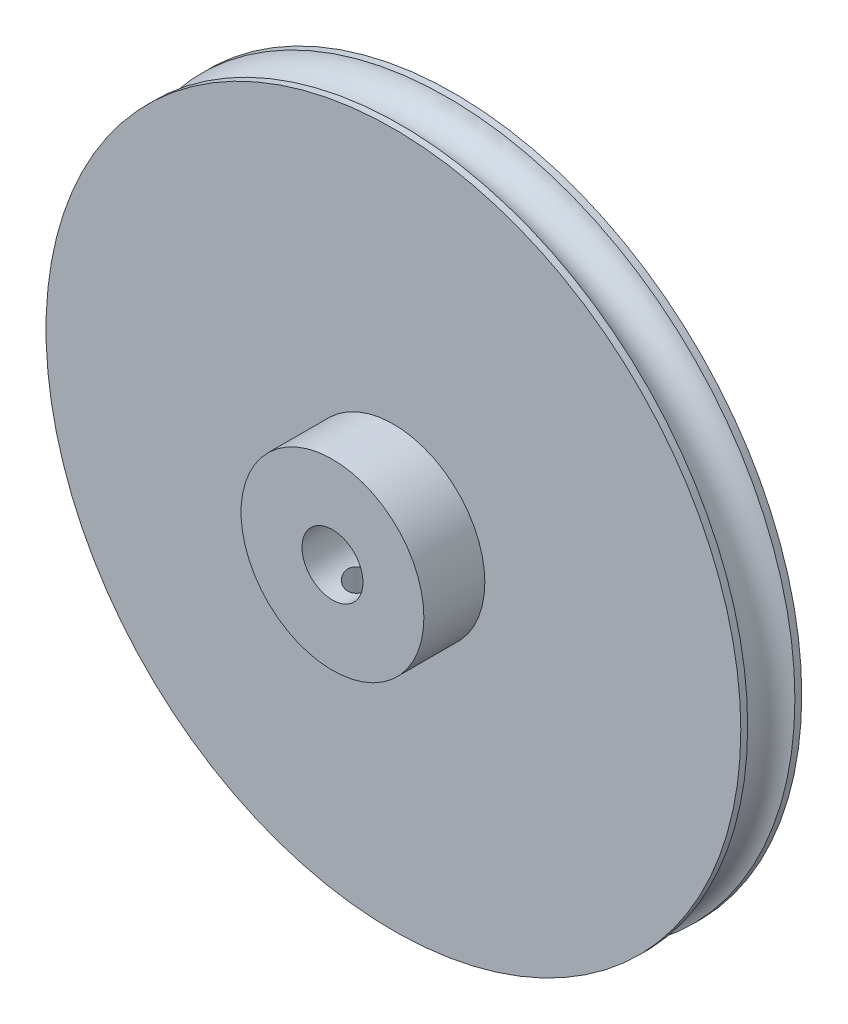
ISO-10303-21;
HEADER;
FILE_DESCRIPTION(('STEP AP214'),'2;1');
FILE_NAME('part.step','',(''),(''),'','','');
FILE_SCHEMA(('AUTOMOTIVE_DESIGN { 1 0 10303 214 1 1 1 1 }'));
ENDSEC;
DATA;
#1=APPLICATION_CONTEXT('core data for automotive mechanical design processes');
#2=APPLICATION_PROTOCOL_DEFINITION('international standard','automotive_design',2000,#1);
#3=PRODUCT_CONTEXT('',#1,'mechanical');
#4=PRODUCT('Part','Part','',(#3));
#5=PRODUCT_RELATED_PRODUCT_CATEGORY('part','',(#4));
#6=PRODUCT_DEFINITION_FORMATION('','',#4);
#7=PRODUCT_DEFINITION_CONTEXT('part definition',#1,'design');
#8=PRODUCT_DEFINITION('design','',#6,#7);
#9=PRODUCT_DEFINITION_SHAPE('','',#8);
#10=(LENGTH_UNIT() NAMED_UNIT(*) SI_UNIT(.MILLI.,.METRE.));
#11=(NAMED_UNIT(*) PLANE_ANGLE_UNIT() SI_UNIT($,.RADIAN.));
#12=(NAMED_UNIT(*) SI_UNIT($,.STERADIAN.) SOLID_ANGLE_UNIT());
#13=UNCERTAINTY_MEASURE_WITH_UNIT(LENGTH_MEASURE(1.E-05),#10,'distance_accuracy_value','');
#14=(GEOMETRIC_REPRESENTATION_CONTEXT(3) GLOBAL_UNCERTAINTY_ASSIGNED_CONTEXT((#13)) GLOBAL_UNIT_ASSIGNED_CONTEXT((#10,
#11,#12)) REPRESENTATION_CONTEXT('',''));
#15=CARTESIAN_POINT('',(0.,0.,0.));
#16=DIRECTION('',(0.,0.,1.));
#17=DIRECTION('',(1.,0.,0.));
#18=AXIS2_PLACEMENT_3D('',#15,#16,#17);
#19=CARTESIAN_POINT('',(0.,0.,-5.));
#20=DIRECTION('',(0.,0.,1.));
#21=DIRECTION('',(1.,0.,0.));
#22=AXIS2_PLACEMENT_3D('',#19,#20,#21);
#23=CYLINDRICAL_SURFACE('',#22,28.5);
#24=CARTESIAN_POINT('',(0.,0.,0.));
#25=DIRECTION('',(0.,0.,1.));
#26=DIRECTION('',(1.,0.,0.));
#27=AXIS2_PLACEMENT_3D('',#24,#25,#26);
#28=CIRCLE('',#27,28.5);
#29=CARTESIAN_POINT('',(28.5,0.,0.));
#30=VERTEX_POINT('',#29);
#31=EDGE_CURVE('E43',#30,#30,#28,.T.);
#32=ORIENTED_EDGE('',*,*,#31,.F.);
#33=EDGE_LOOP('',(#32));
#34=FACE_BOUND('',#33,.T.);
#35=CARTESIAN_POINT('',(0.,0.,-0.563508326896291));
#36=DIRECTION('',(0.,0.,-1.));
#37=DIRECTION('',(-1.,0.,0.));
#38=AXIS2_PLACEMENT_3D('',#35,#36,#37);
#39=CIRCLE('',#38,28.5);
#40=CARTESIAN_POINT('',(-28.5,0.,-0.563508326896291));
#41=VERTEX_POINT('',#40);
#42=EDGE_CURVE('E56',#41,#41,#39,.F.);
#43=ORIENTED_EDGE('',*,*,#42,.T.);
#44=EDGE_LOOP('',(#43));
#45=FACE_BOUND('',#44,.T.);
#46=ADVANCED_FACE('F32',(#34,#45),#23,.T.);
#47=CARTESIAN_POINT('',(0.,0.,-5.));
#48=DIRECTION('',(0.,0.,1.));
#49=DIRECTION('',(1.,0.,0.));
#50=AXIS2_PLACEMENT_3D('',#47,#48,#49);
#51=CIRCLE('',#50,28.5);
#52=CARTESIAN_POINT('',(28.5,0.,-5.));
#53=VERTEX_POINT('',#52);
#54=EDGE_CURVE('E10',#53,#53,#51,.T.);
#55=ORIENTED_EDGE('',*,*,#54,.T.);
#56=EDGE_LOOP('',(#55));
#57=FACE_BOUND('',#56,.T.);
#58=CARTESIAN_POINT('',(0.,0.,-4.43649167310371));
#59=DIRECTION('',(0.,0.,1.));
#60=DIRECTION('',(1.,0.,0.));
#61=AXIS2_PLACEMENT_3D('',#58,#59,#60);
#62=CIRCLE('',#61,28.5);
#63=CARTESIAN_POINT('',(28.5,0.,-4.43649167310371));
#64=VERTEX_POINT('',#63);
#65=EDGE_CURVE('E54',#64,#64,#62,.F.);
#66=ORIENTED_EDGE('',*,*,#65,.T.);
#67=EDGE_LOOP('',(#66));
#68=FACE_BOUND('',#67,.T.);
#69=ADVANCED_FACE('F84',(#57,#68),#23,.T.);
#70=CARTESIAN_POINT('',(0.,0.,0.));
#71=DIRECTION('',(0.,0.,1.));
#72=DIRECTION('',(1.,0.,0.));
#73=AXIS2_PLACEMENT_3D('',#70,#71,#72);
#74=PLANE('',#73);
#75=ORIENTED_EDGE('',*,*,#31,.T.);
#76=EDGE_LOOP('',(#75));
#77=FACE_BOUND('',#76,.T.);
#78=CARTESIAN_POINT('',(0.,0.,0.));
#79=DIRECTION('',(0.,0.,1.));
#80=DIRECTION('',(1.,0.,0.));
#81=AXIS2_PLACEMENT_3D('',#78,#79,#80);
#82=CIRCLE('',#81,7.5);
#83=CARTESIAN_POINT('',(7.5,0.,0.));
#84=VERTEX_POINT('',#83);
#85=EDGE_CURVE('E51',#84,#84,#82,.T.);
#86=ORIENTED_EDGE('',*,*,#85,.F.);
#87=EDGE_LOOP('',(#86));
#88=FACE_BOUND('',#87,.T.);
#89=ADVANCED_FACE('F81',(#77,#88),#74,.T.);
#90=CARTESIAN_POINT('',(0.,0.,-5.));
#91=DIRECTION('',(0.,0.,1.));
#92=DIRECTION('',(1.,0.,0.));
#93=AXIS2_PLACEMENT_3D('',#90,#91,#92);
#94=PLANE('',#93);
#95=CARTESIAN_POINT('',(0.,0.,-5.));
#96=DIRECTION('',(0.,0.,1.));
#97=DIRECTION('',(1.,0.,0.));
#98=AXIS2_PLACEMENT_3D('',#95,#96,#97);
#99=CIRCLE('',#98,2.5);
#100=CARTESIAN_POINT('',(2.5,0.,-5.));
#101=VERTEX_POINT('',#100);
#102=EDGE_CURVE('E63',#101,#101,#99,.F.);
#103=ORIENTED_EDGE('',*,*,#102,.F.);
#104=EDGE_LOOP('',(#103));
#105=FACE_BOUND('',#104,.T.);
#106=ORIENTED_EDGE('',*,*,#54,.F.);
#107=EDGE_LOOP('',(#106));
#108=FACE_BOUND('',#107,.T.);
#109=ADVANCED_FACE('F83',(#105,#108),#94,.F.);
#110=CARTESIAN_POINT('',(0.,0.,5.));
#111=DIRECTION('',(0.,0.,-1.));
#112=DIRECTION('',(-1.,0.,0.));
#113=AXIS2_PLACEMENT_3D('',#110,#111,#112);
#114=CYLINDRICAL_SURFACE('',#113,7.5);
#115=CARTESIAN_POINT('',(0.,-7.5,3.74999999999999));
#116=CARTESIAN_POINT('',(0.0696954524791068,-7.49999880584412,3.74999720552608));
#117=CARTESIAN_POINT('',(0.139428940919409,-7.49901838956517,3.74415136251553));
#118=CARTESIAN_POINT('',(0.276940110836519,-7.49520172470694,3.72093217061733));
#119=CARTESIAN_POINT('',(0.344715933979621,-7.49236376961945,3.70354822154419));
#120=CARTESIAN_POINT('',(0.476302373606318,-7.48515034118225,3.65779227570361));
#121=CARTESIAN_POINT('',(0.540116184215946,-7.48077612579597,3.6294292671797));
#122=CARTESIAN_POINT('',(0.662070920988967,-7.47097113541035,3.56254385397379));
#123=CARTESIAN_POINT('',(0.72021249493929,-7.46554048127217,3.52402261125849));
#124=CARTESIAN_POINT('',(0.829736307145833,-7.45416658729157,3.43752245808976));
#125=CARTESIAN_POINT('',(0.881056451767477,-7.44821935907428,3.38946544268193));
#126=CARTESIAN_POINT('',(0.974944249329956,-7.43651313438366,3.28542601576359));
#127=CARTESIAN_POINT('',(1.01751134969548,-7.43075414981334,3.22944310427169));
#128=CARTESIAN_POINT('',(1.09293356280256,-7.4200378287989,3.11071451690147));
#129=CARTESIAN_POINT('',(1.12572727643049,-7.41508564545818,3.04792933159762));
#130=CARTESIAN_POINT('',(1.1802791827056,-7.40659894897338,2.91764521784968));
#131=CARTESIAN_POINT('',(1.2020381207828,-7.40306434007154,2.85014660816118));
#132=CARTESIAN_POINT('',(1.23370718889239,-7.39785268421378,2.71300986257173));
#133=CARTESIAN_POINT('',(1.24372451456769,-7.3961588424285,2.6433971317493));
#134=CARTESIAN_POINT('',(1.25195836264493,-7.39476969468325,2.50345986155826));
#135=CARTESIAN_POINT('',(1.25017572019449,-7.39507424728607,2.43313537291635));
#136=CARTESIAN_POINT('',(1.23494754919807,-7.39763214431778,2.29453606936228));
#137=CARTESIAN_POINT('',(1.22162244094488,-7.39986536659459,2.22624759822739));
#138=CARTESIAN_POINT('',(1.18387657020171,-7.40599747605504,2.09288934108544));
#139=CARTESIAN_POINT('',(1.15945542715986,-7.40989642036636,2.02781966555573));
#140=CARTESIAN_POINT('',(1.10008862304695,-7.4189423966705,1.90238558827955));
#141=CARTESIAN_POINT('',(1.06509295693985,-7.42409533553663,1.84204529695939));
#142=CARTESIAN_POINT('',(0.985606008778709,-7.43506459207505,1.72804779973081));
#143=CARTESIAN_POINT('',(0.941113960327136,-7.44088096327143,1.67439113377254));
#144=CARTESIAN_POINT('',(0.84324110607952,-7.45261013939893,1.57458695709633));
#145=CARTESIAN_POINT('',(0.789756981936557,-7.45852324615826,1.52854074072997));
#146=CARTESIAN_POINT('',(0.675767624490818,-7.46971300698362,1.44606111866734));
#147=CARTESIAN_POINT('',(0.615262345953206,-7.47498965694873,1.40962777490839));
#148=CARTESIAN_POINT('',(0.488852958083351,-7.48431946446456,1.34739888643187));
#149=CARTESIAN_POINT('',(0.422944362782327,-7.48837159203724,1.32161229033438));
#150=CARTESIAN_POINT('',(0.287649172801363,-7.4947875150633,1.28150289237702));
#151=CARTESIAN_POINT('',(0.218262869589732,-7.49715145175237,1.26717913151315));
#152=CARTESIAN_POINT('',(0.078854950650811,-7.49990564921343,1.25053932076944));
#153=CARTESIAN_POINT('',(0.00885036857550532,-7.50031876506392,1.24808421409721));
#154=CARTESIAN_POINT('',(-0.130569886444943,-7.49918737210585,1.25488067221407));
#155=CARTESIAN_POINT('',(-0.199985581946018,-7.49764293862059,1.26413178656688));
#156=CARTESIAN_POINT('',(-0.335828087773379,-7.49278413469101,1.29396242466775));
#157=CARTESIAN_POINT('',(-0.402270434192687,-7.48948052400655,1.31447310419507));
#158=CARTESIAN_POINT('',(-0.530773442430217,-7.48147232227679,1.36616725909978));
#159=CARTESIAN_POINT('',(-0.592833857954855,-7.4767676525601,1.39735133381765));
#160=CARTESIAN_POINT('',(-0.711415344734474,-7.46642258151204,1.4698255623484));
#161=CARTESIAN_POINT('',(-0.767882625468568,-7.46077427943511,1.51120257808363));
#162=CARTESIAN_POINT('',(-0.873121792751337,-7.4491923369595,1.60276865769254));
#163=CARTESIAN_POINT('',(-0.921893119848284,-7.44325867585773,1.65295836163834));
#164=CARTESIAN_POINT('',(-1.01087138982899,-7.43170087617923,1.76134877403572));
#165=CARTESIAN_POINT('',(-1.05098438055685,-7.42608058068553,1.81962708275721));
#166=CARTESIAN_POINT('',(-1.12085115514748,-7.41585764888942,1.94217648456927));
#167=CARTESIAN_POINT('',(-1.1506052673849,-7.4112549803301,2.00644738761375));
#168=CARTESIAN_POINT('',(-1.19876916573657,-7.40361726848852,2.13889486640607));
#169=CARTESIAN_POINT('',(-1.21722571627396,-7.40057577155532,2.20705404751525));
#170=CARTESIAN_POINT('',(-1.24241772688913,-7.39638858417631,2.34556006461088));
#171=CARTESIAN_POINT('',(-1.24915420597307,-7.39524272891361,2.41590670986603));
#172=CARTESIAN_POINT('',(-1.25068643302367,-7.39498366542006,2.5558525829812));
#173=CARTESIAN_POINT('',(-1.24563006806258,-7.39584528252825,2.62545018928764));
#174=CARTESIAN_POINT('',(-1.22403991947841,-7.39944890726864,2.76278962402538));
#175=CARTESIAN_POINT('',(-1.20750617305623,-7.40219090880607,2.83053145847093));
#176=CARTESIAN_POINT('',(-1.16348724479744,-7.40923678140859,2.9621792186463));
#177=CARTESIAN_POINT('',(-1.13601479530021,-7.41353883609835,3.02608950502801));
#178=CARTESIAN_POINT('',(-1.07091350195795,-7.42322184461104,3.14841783459742));
#179=CARTESIAN_POINT('',(-1.03328415437427,-7.428602851942,3.20683560518606));
#180=CARTESIAN_POINT('',(-0.94840944218607,-7.43991727022811,3.31726779155387));
#181=CARTESIAN_POINT('',(-0.901055281796816,-7.44585647788151,3.36919800835013));
#182=CARTESIAN_POINT('',(-0.798304515690108,-7.45757186180421,3.46442580223746));
#183=CARTESIAN_POINT('',(-0.742906056456312,-7.46334800013273,3.50772138431908));
#184=CARTESIAN_POINT('',(-0.625184584820136,-7.4741326482111,3.58472413409996));
#185=CARTESIAN_POINT('',(-0.562816393766405,-7.47913558126552,3.61836301965647));
#186=CARTESIAN_POINT('',(-0.433256534689487,-7.48775583800888,3.67463474230495));
#187=CARTESIAN_POINT('',(-0.366069747415002,-7.49137454088741,3.69727854053984));
#188=CARTESIAN_POINT('',(-0.248851655022698,-7.49602895416478,3.72600263706332));
#189=CARTESIAN_POINT('',(-0.199529415149222,-7.49751013636679,3.73498723480797));
#190=CARTESIAN_POINT('',(-0.100144655159903,-7.4994960799306,3.74698686892237));
#191=CARTESIAN_POINT('',(-0.0500821478042465,-7.50000085810321,3.75000200806867));
#192=CARTESIAN_POINT('',(0.,-7.5,3.74999999999999));
#193=B_SPLINE_CURVE_WITH_KNOTS('',3,(#115,#116,#117,#118,#119,#120,#121,#122,#123,#124,#125,
#126,#127,#128,#129,#130,#131,#132,#133,#134,#135,#136,#137,#138,#139,#140,#141,#142,#143,#144,
#145,#146,#147,#148,#149,#150,#151,#152,#153,#154,#155,#156,#157,#158,#159,#160,#161,#162,#163,
#164,#165,#166,#167,#168,#169,#170,#171,#172,#173,#174,#175,#176,#177,#178,#179,#180,#181,#182,
#183,#184,#185,#186,#187,#188,#189,#190,#191,#192),.UNSPECIFIED.,.T.,.F.,(4,2,2,2,2,2,2,2,2,2,2,
2,2,2,2,2,2,2,2,2,2,2,2,2,2,2,2,2,2,2,2,2,2,2,2,2,2,2,4),(0.,0.208903292469253,
0.417998772847707,0.62692343351263,0.835824206337388,1.04651245531165,1.25721400084927,
1.46921260411919,1.68119688438089,1.8912303855171,2.10124902160442,2.30910260880203,
2.51696332512689,2.72582278316277,2.93469910340284,3.14616384955661,3.35762995817921,
3.56927344457949,3.78089922260571,3.99003941745695,4.19917156517926,4.40703903503204,
4.61491817913029,4.82463412813508,5.03436531527137,5.24626911003805,5.45816618687967,
5.66918011170882,5.88017568893304,6.08853954761345,6.29690273094061,6.50502409113106,
6.71315577514663,6.9237569209669,7.1344066693948,7.34651115803594,7.5584037606503,
7.70852124082003,7.85863613638478),.UNSPECIFIED.);
#194=CARTESIAN_POINT('',(0.,-7.5,3.74999999999999));
#195=VERTEX_POINT('',#194);
#196=EDGE_CURVE('E35',#195,#195,#193,.T.);
#197=ORIENTED_EDGE('',*,*,#196,.T.);
#198=EDGE_LOOP('',(#197));
#199=FACE_BOUND('',#198,.T.);
#200=CARTESIAN_POINT('',(0.,0.,5.));
#201=DIRECTION('',(0.,0.,1.));
#202=DIRECTION('',(1.,0.,0.));
#203=AXIS2_PLACEMENT_3D('',#200,#201,#202);
#204=CIRCLE('',#203,7.5);
#205=CARTESIAN_POINT('',(7.5,0.,5.));
#206=VERTEX_POINT('',#205);
#207=EDGE_CURVE('E48',#206,#206,#204,.T.);
#208=ORIENTED_EDGE('',*,*,#207,.F.);
#209=EDGE_LOOP('',(#208));
#210=FACE_BOUND('',#209,.T.);
#211=ORIENTED_EDGE('',*,*,#85,.T.);
#212=EDGE_LOOP('',(#211));
#213=FACE_BOUND('',#212,.T.);
#214=ADVANCED_FACE('F79',(#199,#210,#213),#114,.T.);
#215=CARTESIAN_POINT('',(0.,0.,5.));
#216=DIRECTION('',(0.,0.,1.));
#217=DIRECTION('',(1.,0.,0.));
#218=AXIS2_PLACEMENT_3D('',#215,#216,#217);
#219=PLANE('',#218);
#220=CARTESIAN_POINT('',(0.,0.,5.));
#221=DIRECTION('',(0.,0.,1.));
#222=DIRECTION('',(1.,0.,0.));
#223=AXIS2_PLACEMENT_3D('',#220,#221,#222);
#224=CIRCLE('',#223,2.5);
#225=CARTESIAN_POINT('',(2.5,0.,5.));
#226=VERTEX_POINT('',#225);
#227=EDGE_CURVE('E59',#226,#226,#224,.T.);
#228=ORIENTED_EDGE('',*,*,#227,.F.);
#229=EDGE_LOOP('',(#228));
#230=FACE_BOUND('',#229,.T.);
#231=ORIENTED_EDGE('',*,*,#207,.T.);
#232=EDGE_LOOP('',(#231));
#233=FACE_BOUND('',#232,.T.);
#234=ADVANCED_FACE('F128',(#230,#233),#219,.T.);
#235=CARTESIAN_POINT('',(0.,0.,-5.001));
#236=DIRECTION('',(0.,0.,1.));
#237=DIRECTION('',(1.,0.,0.));
#238=AXIS2_PLACEMENT_3D('',#235,#236,#237);
#239=CYLINDRICAL_SURFACE('',#238,2.5);
#240=CARTESIAN_POINT('',(0.,-2.5,3.74999999999999));
#241=CARTESIAN_POINT('',(-0.0657149536912326,-2.49999641755189,3.74999587210061));
#242=CARTESIAN_POINT('',(-0.13150824962254,-2.49738113774397,3.7447874085979));
#243=CARTESIAN_POINT('',(-0.26115029408553,-2.48717695046745,3.72418389957384));
#244=CARTESIAN_POINT('',(-0.324995108391877,-2.47957859786229,3.70876950875293));
#245=CARTESIAN_POINT('',(-0.448666931100715,-2.4602034925414,3.668507739229));
#246=CARTESIAN_POINT('',(-0.508508503673971,-2.448442989719,3.64369701968998));
#247=CARTESIAN_POINT('',(-0.623090771008202,-2.42182220644723,3.58553672329381));
#248=CARTESIAN_POINT('',(-0.677831867487558,-2.40696217041913,3.55218781968893));
#249=CARTESIAN_POINT('',(-0.784384772202393,-2.37445322822571,3.47560343814337));
#250=CARTESIAN_POINT('',(-0.835819013902634,-2.3566899890942,3.43189190095044));
#251=CARTESIAN_POINT('',(-0.930974306083715,-2.32074962808431,3.3368481509412));
#252=CARTESIAN_POINT('',(-0.974689478883451,-2.30257220261294,3.28551018528444));
#253=CARTESIAN_POINT('',(-1.05656500056284,-2.26623688996684,3.17189581309577));
#254=CARTESIAN_POINT('',(-1.09403166943954,-2.24818983712665,3.1090798770676));
#255=CARTESIAN_POINT('',(-1.15771028361336,-2.21607473465401,2.97704083001723));
#256=CARTESIAN_POINT('',(-1.18393026870791,-2.20200384508738,2.90782233909656));
#257=CARTESIAN_POINT('',(-1.22266555273573,-2.18072333797261,2.76916861822259));
#258=CARTESIAN_POINT('',(-1.23590732135054,-2.17315339479642,2.69999443491575));
#259=CARTESIAN_POINT('',(-1.25053374163605,-2.1647736243566,2.56002645277565));
#260=CARTESIAN_POINT('',(-1.25193011046633,-2.16395711679111,2.48923432391106));
#261=CARTESIAN_POINT('',(-1.24335910896536,-2.16888662821561,2.35714246960579));
#262=CARTESIAN_POINT('',(-1.23473069942102,-2.17385954577518,2.29571996097119));
#263=CARTESIAN_POINT('',(-1.20867481132116,-2.18845285917313,2.1753476132837));
#264=CARTESIAN_POINT('',(-1.19124452987205,-2.19807473539721,2.11639856836836));
#265=CARTESIAN_POINT('',(-1.14776222548249,-2.22109345515927,2.00096358429293));
#266=CARTESIAN_POINT('',(-1.12151883389498,-2.23457300829999,1.94456700151777));
#267=CARTESIAN_POINT('',(-1.06130210958499,-2.26379255351755,1.83670713426249));
#268=CARTESIAN_POINT('',(-1.02732530476557,-2.27953355975239,1.78524608049989));
#269=CARTESIAN_POINT('',(-0.947582568640976,-2.31391447379108,1.68184843407097));
#270=CARTESIAN_POINT('',(-0.900868072961593,-2.33266887795933,1.63067890802981));
#271=CARTESIAN_POINT('',(-0.799444473426708,-2.36934529125509,1.53658072676138));
#272=CARTESIAN_POINT('',(-0.744731570717848,-2.38726689948501,1.49365600995765));
#273=CARTESIAN_POINT('',(-0.625645632289803,-2.42127484103705,1.41539292371285));
#274=CARTESIAN_POINT('',(-0.560941989499254,-2.43723730202509,1.38049940944283));
#275=CARTESIAN_POINT('',(-0.42558276936099,-2.46447351401553,1.32237871369625));
#276=CARTESIAN_POINT('',(-0.35493197033159,-2.47575098679441,1.29914226873105));
#277=CARTESIAN_POINT('',(-0.215958114575873,-2.49155417176795,1.26690574535417));
#278=CARTESIAN_POINT('',(-0.147926913185401,-2.4965617287664,1.25688595531654));
#279=CARTESIAN_POINT('',(-0.0109744999366891,-2.50091266823877,1.2481690860819));
#280=CARTESIAN_POINT('',(0.057946274837379,-2.5002587340164,1.24946664295066));
#281=CARTESIAN_POINT('',(0.189041214982493,-2.49363990316801,1.26275836052345));
#282=CARTESIAN_POINT('',(0.251324260062444,-2.48809057110237,1.27391566591255));
#283=CARTESIAN_POINT('',(0.373008615377396,-2.47277714143524,1.30529758986887));
#284=CARTESIAN_POINT('',(0.432409607113745,-2.46301257917916,1.32552320806671));
#285=CARTESIAN_POINT('',(0.54861076056208,-2.43980314267087,1.37499808304148));
#286=CARTESIAN_POINT('',(0.60528799625769,-2.42626102212424,1.40448881264603));
#287=CARTESIAN_POINT('',(0.713076702123648,-2.39679967896386,1.47138441955756));
#288=CARTESIAN_POINT('',(0.764185787219099,-2.38087944457232,1.5087926682418));
#289=CARTESIAN_POINT('',(0.864709611613313,-2.34635276671831,1.5947005316661));
#290=CARTESIAN_POINT('',(0.913465097280794,-2.32763606060552,1.64392858556697));
#291=CARTESIAN_POINT('',(1.00232040139154,-2.29077989504843,1.74990643908664));
#292=CARTESIAN_POINT('',(1.04241423211355,-2.27264084226908,1.80666139852048));
#293=CARTESIAN_POINT('',(1.11463489312211,-2.23813990282585,1.9295545677504));
#294=CARTESIAN_POINT('',(1.14628186984829,-2.2219066207934,1.99601408276075));
#295=CARTESIAN_POINT('',(1.19760353251725,-2.19467590460158,2.13438758461566));
#296=CARTESIAN_POINT('',(1.21729364485945,-2.18367172800773,2.20629440812649));
#297=CARTESIAN_POINT('',(1.24232710931209,-2.16951876260834,2.34613777857682));
#298=CARTESIAN_POINT('',(1.24886624550107,-2.16571729325615,2.4137928167863));
#299=CARTESIAN_POINT('',(1.25086144297597,-2.16456693307719,2.54930883396341));
#300=CARTESIAN_POINT('',(1.24632230828049,-2.16721524534441,2.61716971092429));
#301=CARTESIAN_POINT('',(1.22740765699032,-2.17797327562531,2.74435437691502));
#302=CARTESIAN_POINT('',(1.21401039292849,-2.18553868102993,2.8038755876805));
#303=CARTESIAN_POINT('',(1.1789691977808,-2.20463770234897,2.91976014928088));
#304=CARTESIAN_POINT('',(1.15732261394975,-2.21617259462095,2.97612247761496));
#305=CARTESIAN_POINT('',(1.10476968162584,-2.24285662955661,3.08828106373326));
#306=CARTESIAN_POINT('',(1.07333892227056,-2.25819652995239,3.14378487728712));
#307=CARTESIAN_POINT('',(1.00268871454578,-2.29044164543238,3.24909317022573));
#308=CARTESIAN_POINT('',(0.9634652140483,-2.30734767243153,3.29889466314811));
#309=CARTESIAN_POINT('',(0.872754158330791,-2.34327903949142,3.39767747794702));
#310=CARTESIAN_POINT('',(0.820355528762703,-2.36231229139336,3.4458238779524));
#311=CARTESIAN_POINT('',(0.707693507775339,-2.3984719031886,3.53282872927954));
#312=CARTESIAN_POINT('',(0.647425904070971,-2.4155972326005,3.57168217428286));
#313=CARTESIAN_POINT('',(0.519914496024924,-2.44622511981379,3.63904545345275));
#314=CARTESIAN_POINT('',(0.452624379918259,-2.45970120703636,3.66748021176429));
#315=CARTESIAN_POINT('',(0.313427626617731,-2.48126676704332,3.71226020989868));
#316=CARTESIAN_POINT('',(0.24153474952895,-2.48937154216165,3.72863980853696));
#317=CARTESIAN_POINT('',(0.140752433104224,-2.49619327387079,3.7423717638448));
#318=CARTESIAN_POINT('',(0.112702349299369,-2.49761706674002,3.74522830107951));
#319=CARTESIAN_POINT('',(0.0564396647589448,-2.49952121222331,3.749043331896));
#320=CARTESIAN_POINT('',(0.0282270595592256,-2.50000153879704,3.75000177308899));
#321=CARTESIAN_POINT('',(0.,-2.5,3.74999999999999));
#322=B_SPLINE_CURVE_WITH_KNOTS('',3,(#240,#241,#242,#243,#244,#245,#246,#247,#248,#249,#250,
#251,#252,#253,#254,#255,#256,#257,#258,#259,#260,#261,#262,#263,#264,#265,#266,#267,#268,#269,
#270,#271,#272,#273,#274,#275,#276,#277,#278,#279,#280,#281,#282,#283,#284,#285,#286,#287,#288,
#289,#290,#291,#292,#293,#294,#295,#296,#297,#298,#299,#300,#301,#302,#303,#304,#305,#306,#307,
#308,#309,#310,#311,#312,#313,#314,#315,#316,#317,#318,#319,#320,#321),.UNSPECIFIED.,.T.,.F.,(4,
2,2,2,2,2,2,2,2,2,2,2,2,2,2,2,2,2,2,2,2,2,2,2,2,2,2,2,2,2,2,2,2,2,2,2,2,2,2,2,4),(0.,
0.197030321775364,0.394435187136494,0.591077694365369,0.787704700726954,0.996227198397604,
1.20490779706754,1.4297715803844,1.6544743487285,1.86572515175285,2.07676696661274,
2.26257140511649,2.44843504907096,2.63862800210607,2.82890651575275,3.04331176667346,
3.25781918248355,3.48228777768048,3.70657771140347,3.91229113089179,4.11790705639342,
4.30758633132649,4.49728652038661,4.6924107003487,4.8876181343542,5.1019951330552,
5.31651985769286,5.54143352699588,5.76605639925968,5.96911634372962,6.17208824825002,
6.35572412805223,6.53941910979592,6.73545570969512,6.93159451423692,7.15156553440618,
7.3716547922071,7.5933001707865,7.81431135781157,7.89894100172116,7.98357298143552),.UNSPECIFIED.);
#323=CARTESIAN_POINT('',(0.,-2.5,3.74999999999999));
#324=VERTEX_POINT('',#323);
#325=EDGE_CURVE('E57',#324,#324,#322,.T.);
#326=ORIENTED_EDGE('',*,*,#325,.T.);
#327=EDGE_LOOP('',(#326));
#328=FACE_BOUND('',#327,.T.);
#329=ORIENTED_EDGE('',*,*,#227,.T.);
#330=EDGE_LOOP('',(#329));
#331=FACE_BOUND('',#330,.T.);
#332=ORIENTED_EDGE('',*,*,#102,.T.);
#333=EDGE_LOOP('',(#332));
#334=FACE_BOUND('',#333,.T.);
#335=ADVANCED_FACE('F120',(#328,#331,#334),#239,.F.);
#336=CARTESIAN_POINT('',(0.,0.,-2.5));
#337=DIRECTION('',(0.,0.,1.));
#338=DIRECTION('',(1.,0.,0.));
#339=AXIS2_PLACEMENT_3D('',#336,#337,#338);
#340=TOROIDAL_SURFACE('',#339,29.,2.);
#341=ORIENTED_EDGE('',*,*,#42,.F.);
#342=EDGE_LOOP('',(#341));
#343=FACE_BOUND('',#342,.T.);
#344=ORIENTED_EDGE('',*,*,#65,.F.);
#345=EDGE_LOOP('',(#344));
#346=FACE_BOUND('',#345,.T.);
#347=ADVANCED_FACE('F111',(#343,#346),#340,.F.);
#348=CARTESIAN_POINT('',(0.,0.,2.5));
#349=DIRECTION('',(0.,1.,0.));
#350=DIRECTION('',(0.,0.,1.));
#351=AXIS2_PLACEMENT_3D('',#348,#349,#350);
#352=CYLINDRICAL_SURFACE('',#351,1.24999999999999);
#353=ORIENTED_EDGE('',*,*,#196,.F.);
#354=EDGE_LOOP('',(#353));
#355=FACE_BOUND('',#354,.T.);
#356=ORIENTED_EDGE('',*,*,#325,.F.);
#357=EDGE_LOOP('',(#356));
#358=FACE_BOUND('',#357,.T.);
#359=ADVANCED_FACE('F107',(#355,#358),#352,.F.);
#360=CLOSED_SHELL('',(#46,#69,#89,#109,#214,#234,#335,#347,#359));
#361=MANIFOLD_SOLID_BREP('B2',#360);
#362=ADVANCED_BREP_SHAPE_REPRESENTATION('',(#18,#361),#14);
#363=SHAPE_DEFINITION_REPRESENTATION(#9,#362);
ENDSEC;
END-ISO-10303-21;
